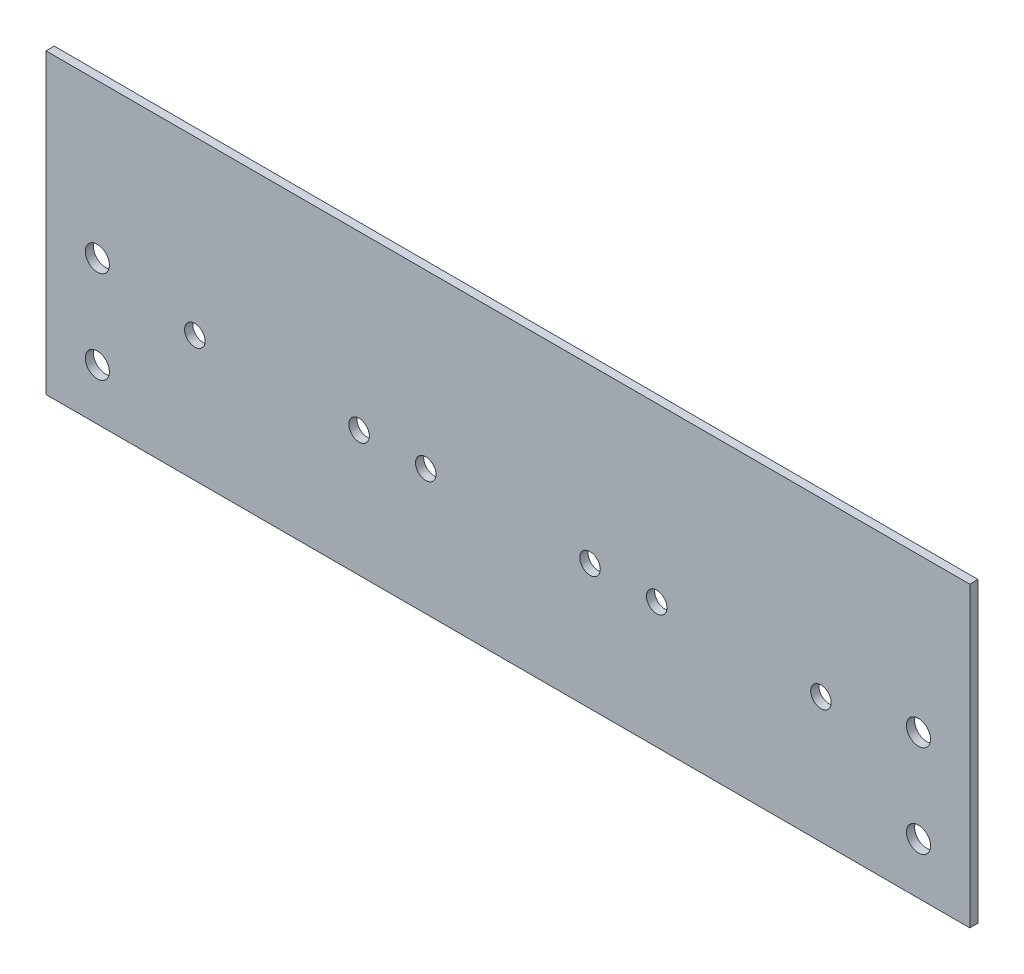
ISO-10303-21;
HEADER;
FILE_DESCRIPTION(('STEP AP214'),'2;1');
FILE_NAME('part.step','',(''),(''),'','','');
FILE_SCHEMA(('AUTOMOTIVE_DESIGN { 1 0 10303 214 1 1 1 1 }'));
ENDSEC;
DATA;
#1=APPLICATION_CONTEXT('core data for automotive mechanical design processes');
#2=APPLICATION_PROTOCOL_DEFINITION('international standard','automotive_design',2000,#1);
#3=PRODUCT_CONTEXT('',#1,'mechanical');
#4=PRODUCT('Part','Part','',(#3));
#5=PRODUCT_RELATED_PRODUCT_CATEGORY('part','',(#4));
#6=PRODUCT_DEFINITION_FORMATION('','',#4);
#7=PRODUCT_DEFINITION_CONTEXT('part definition',#1,'design');
#8=PRODUCT_DEFINITION('design','',#6,#7);
#9=PRODUCT_DEFINITION_SHAPE('','',#8);
#10=(LENGTH_UNIT() NAMED_UNIT(*) SI_UNIT(.MILLI.,.METRE.));
#11=(NAMED_UNIT(*) PLANE_ANGLE_UNIT() SI_UNIT($,.RADIAN.));
#12=(NAMED_UNIT(*) SI_UNIT($,.STERADIAN.) SOLID_ANGLE_UNIT());
#13=UNCERTAINTY_MEASURE_WITH_UNIT(LENGTH_MEASURE(1.E-05),#10,'distance_accuracy_value','');
#14=(GEOMETRIC_REPRESENTATION_CONTEXT(3) GLOBAL_UNCERTAINTY_ASSIGNED_CONTEXT((#13)) GLOBAL_UNIT_ASSIGNED_CONTEXT((#10,
#11,#12)) REPRESENTATION_CONTEXT('',''));
#15=CARTESIAN_POINT('',(0.,0.,0.));
#16=DIRECTION('',(0.,0.,1.));
#17=DIRECTION('',(1.,0.,0.));
#18=AXIS2_PLACEMENT_3D('',#15,#16,#17);
#19=CARTESIAN_POINT('',(180.,0.,1.6));
#20=DIRECTION('',(1.,0.,0.));
#21=DIRECTION('',(0.,0.,-1.));
#22=AXIS2_PLACEMENT_3D('',#19,#20,#21);
#23=PLANE('',#22);
#24=DIRECTION('',(0.,-1.,0.));
#25=VECTOR('',#24,1.);
#26=CARTESIAN_POINT('',(180.,0.,0.));
#27=LINE('',#26,#25);
#28=CARTESIAN_POINT('',(180.,58.,0.));
#29=VERTEX_POINT('',#28);
#30=CARTESIAN_POINT('',(180.,0.,0.));
#31=VERTEX_POINT('',#30);
#32=EDGE_CURVE('E137',#29,#31,#27,.T.);
#33=ORIENTED_EDGE('',*,*,#32,.F.);
#34=DIRECTION('',(0.,0.,-1.));
#35=VECTOR('',#34,1.);
#36=CARTESIAN_POINT('',(180.,58.,1.6));
#37=LINE('',#36,#35);
#38=CARTESIAN_POINT('',(180.,58.,1.6));
#39=VERTEX_POINT('',#38);
#40=EDGE_CURVE('E11',#39,#29,#37,.T.);
#41=ORIENTED_EDGE('',*,*,#40,.F.);
#42=DIRECTION('',(0.,-1.,0.));
#43=VECTOR('',#42,1.);
#44=CARTESIAN_POINT('',(180.,0.,1.6));
#45=LINE('',#44,#43);
#46=CARTESIAN_POINT('',(180.,0.,1.6));
#47=VERTEX_POINT('',#46);
#48=EDGE_CURVE('E100',#39,#47,#45,.T.);
#49=ORIENTED_EDGE('',*,*,#48,.T.);
#50=DIRECTION('',(0.,0.,-1.));
#51=VECTOR('',#50,1.);
#52=CARTESIAN_POINT('',(180.,0.,1.6));
#53=LINE('',#52,#51);
#54=EDGE_CURVE('E79',#47,#31,#53,.T.);
#55=ORIENTED_EDGE('',*,*,#54,.T.);
#56=EDGE_LOOP('',(#33,#41,#49,#55));
#57=FACE_BOUND('',#56,.T.);
#58=ADVANCED_FACE('F39',(#57),#23,.T.);
#59=CARTESIAN_POINT('',(0.,58.,1.6));
#60=DIRECTION('',(0.,1.,0.));
#61=DIRECTION('',(0.,0.,1.));
#62=AXIS2_PLACEMENT_3D('',#59,#60,#61);
#63=PLANE('',#62);
#64=DIRECTION('',(1.,0.,0.));
#65=VECTOR('',#64,1.);
#66=CARTESIAN_POINT('',(0.,58.,0.));
#67=LINE('',#66,#65);
#68=CARTESIAN_POINT('',(0.,58.,0.));
#69=VERTEX_POINT('',#68);
#70=EDGE_CURVE('E91',#69,#29,#67,.T.);
#71=ORIENTED_EDGE('',*,*,#70,.F.);
#72=DIRECTION('',(0.,0.,-1.));
#73=VECTOR('',#72,1.);
#74=CARTESIAN_POINT('',(0.,58.,1.6));
#75=LINE('',#74,#73);
#76=CARTESIAN_POINT('',(0.,58.,1.6));
#77=VERTEX_POINT('',#76);
#78=EDGE_CURVE('E48',#77,#69,#75,.T.);
#79=ORIENTED_EDGE('',*,*,#78,.F.);
#80=DIRECTION('',(1.,0.,0.));
#81=VECTOR('',#80,1.);
#82=CARTESIAN_POINT('',(0.,58.,1.6));
#83=LINE('',#82,#81);
#84=EDGE_CURVE('E89',#77,#39,#83,.T.);
#85=ORIENTED_EDGE('',*,*,#84,.T.);
#86=ORIENTED_EDGE('',*,*,#40,.T.);
#87=EDGE_LOOP('',(#71,#79,#85,#86));
#88=FACE_BOUND('',#87,.T.);
#89=ADVANCED_FACE('F87',(#88),#63,.T.);
#90=CARTESIAN_POINT('',(0.,0.,1.6));
#91=DIRECTION('',(1.,0.,0.));
#92=DIRECTION('',(0.,1.,0.));
#93=AXIS2_PLACEMENT_3D('',#90,#91,#92);
#94=PLANE('',#93);
#95=DIRECTION('',(0.,-1.,0.));
#96=VECTOR('',#95,1.);
#97=CARTESIAN_POINT('',(0.,0.,0.));
#98=LINE('',#97,#96);
#99=CARTESIAN_POINT('',(0.,0.,0.));
#100=VERTEX_POINT('',#99);
#101=EDGE_CURVE('E140',#69,#100,#98,.T.);
#102=ORIENTED_EDGE('',*,*,#101,.T.);
#103=DIRECTION('',(0.,0.,-1.));
#104=VECTOR('',#103,1.);
#105=CARTESIAN_POINT('',(0.,0.,1.6));
#106=LINE('',#105,#104);
#107=CARTESIAN_POINT('',(0.,0.,1.6));
#108=VERTEX_POINT('',#107);
#109=EDGE_CURVE('E94',#108,#100,#106,.T.);
#110=ORIENTED_EDGE('',*,*,#109,.F.);
#111=DIRECTION('',(0.,-1.,0.));
#112=VECTOR('',#111,1.);
#113=CARTESIAN_POINT('',(0.,0.,1.6));
#114=LINE('',#113,#112);
#115=EDGE_CURVE('E96',#77,#108,#114,.T.);
#116=ORIENTED_EDGE('',*,*,#115,.F.);
#117=ORIENTED_EDGE('',*,*,#78,.T.);
#118=EDGE_LOOP('',(#102,#110,#116,#117));
#119=FACE_BOUND('',#118,.T.);
#120=ADVANCED_FACE('F97',(#119),#94,.F.);
#121=CARTESIAN_POINT('',(10.,28.,1.6));
#122=DIRECTION('',(0.,0.,-1.));
#123=DIRECTION('',(-1.,0.,0.));
#124=AXIS2_PLACEMENT_3D('',#121,#122,#123);
#125=CYLINDRICAL_SURFACE('',#124,2.35000000000001);
#126=CARTESIAN_POINT('',(10.,28.,1.6));
#127=DIRECTION('',(0.,0.,1.));
#128=DIRECTION('',(1.,0.,0.));
#129=AXIS2_PLACEMENT_3D('',#126,#127,#128);
#130=CIRCLE('',#129,2.35000000000001);
#131=CARTESIAN_POINT('',(12.35,28.,1.6));
#132=VERTEX_POINT('',#131);
#133=EDGE_CURVE('E102',#132,#132,#130,.T.);
#134=ORIENTED_EDGE('',*,*,#133,.T.);
#135=EDGE_LOOP('',(#134));
#136=FACE_BOUND('',#135,.T.);
#137=CARTESIAN_POINT('',(10.,28.,0.));
#138=DIRECTION('',(0.,0.,1.));
#139=DIRECTION('',(1.,0.,0.));
#140=AXIS2_PLACEMENT_3D('',#137,#138,#139);
#141=CIRCLE('',#140,2.35000000000001);
#142=CARTESIAN_POINT('',(12.35,28.,0.));
#143=VERTEX_POINT('',#142);
#144=EDGE_CURVE('E134',#143,#143,#141,.T.);
#145=ORIENTED_EDGE('',*,*,#144,.F.);
#146=EDGE_LOOP('',(#145));
#147=FACE_BOUND('',#146,.T.);
#148=ADVANCED_FACE('F156',(#136,#147),#125,.F.);
#149=CARTESIAN_POINT('',(10.,10.0000000000005,1.6));
#150=DIRECTION('',(0.,0.,-1.));
#151=DIRECTION('',(-1.,0.,0.));
#152=AXIS2_PLACEMENT_3D('',#149,#150,#151);
#153=CYLINDRICAL_SURFACE('',#152,2.35);
#154=CARTESIAN_POINT('',(10.,10.0000000000005,1.6));
#155=DIRECTION('',(0.,0.,1.));
#156=DIRECTION('',(1.,0.,0.));
#157=AXIS2_PLACEMENT_3D('',#154,#155,#156);
#158=CIRCLE('',#157,2.35);
#159=CARTESIAN_POINT('',(12.35,10.0000000000005,1.6));
#160=VERTEX_POINT('',#159);
#161=EDGE_CURVE('E390',#160,#160,#158,.T.);
#162=ORIENTED_EDGE('',*,*,#161,.T.);
#163=EDGE_LOOP('',(#162));
#164=FACE_BOUND('',#163,.T.);
#165=CARTESIAN_POINT('',(10.,10.0000000000005,0.));
#166=DIRECTION('',(0.,0.,1.));
#167=DIRECTION('',(1.,0.,0.));
#168=AXIS2_PLACEMENT_3D('',#165,#166,#167);
#169=CIRCLE('',#168,2.35);
#170=CARTESIAN_POINT('',(12.35,10.0000000000005,0.));
#171=VERTEX_POINT('',#170);
#172=EDGE_CURVE('E131',#171,#171,#169,.T.);
#173=ORIENTED_EDGE('',*,*,#172,.F.);
#174=EDGE_LOOP('',(#173));
#175=FACE_BOUND('',#174,.T.);
#176=ADVANCED_FACE('F159',(#164,#175),#153,.F.);
#177=CARTESIAN_POINT('',(29.,24.5000000000005,1.6));
#178=DIRECTION('',(0.,0.,-1.));
#179=DIRECTION('',(-1.,0.,0.));
#180=AXIS2_PLACEMENT_3D('',#177,#178,#179);
#181=CYLINDRICAL_SURFACE('',#180,1.99999999999995);
#182=CARTESIAN_POINT('',(29.,24.5000000000005,1.6));
#183=DIRECTION('',(0.,0.,1.));
#184=DIRECTION('',(1.,0.,0.));
#185=AXIS2_PLACEMENT_3D('',#182,#183,#184);
#186=CIRCLE('',#185,1.99999999999995);
#187=CARTESIAN_POINT('',(31.,24.5000000000005,1.6));
#188=VERTEX_POINT('',#187);
#189=EDGE_CURVE('E386',#188,#188,#186,.T.);
#190=ORIENTED_EDGE('',*,*,#189,.T.);
#191=EDGE_LOOP('',(#190));
#192=FACE_BOUND('',#191,.T.);
#193=CARTESIAN_POINT('',(29.,24.5000000000005,0.));
#194=DIRECTION('',(0.,0.,1.));
#195=DIRECTION('',(1.,0.,0.));
#196=AXIS2_PLACEMENT_3D('',#193,#194,#195);
#197=CIRCLE('',#196,1.99999999999995);
#198=CARTESIAN_POINT('',(31.,24.5000000000005,0.));
#199=VERTEX_POINT('',#198);
#200=EDGE_CURVE('E128',#199,#199,#197,.T.);
#201=ORIENTED_EDGE('',*,*,#200,.F.);
#202=EDGE_LOOP('',(#201));
#203=FACE_BOUND('',#202,.T.);
#204=ADVANCED_FACE('F163',(#192,#203),#181,.F.);
#205=CARTESIAN_POINT('',(61.,24.5000000000005,1.6));
#206=DIRECTION('',(0.,0.,-1.));
#207=DIRECTION('',(-1.,0.,0.));
#208=AXIS2_PLACEMENT_3D('',#205,#206,#207);
#209=CYLINDRICAL_SURFACE('',#208,1.99999999999997);
#210=CARTESIAN_POINT('',(61.,24.5000000000005,1.6));
#211=DIRECTION('',(0.,0.,1.));
#212=DIRECTION('',(1.,0.,0.));
#213=AXIS2_PLACEMENT_3D('',#210,#211,#212);
#214=CIRCLE('',#213,1.99999999999997);
#215=CARTESIAN_POINT('',(63.,24.5000000000005,1.6));
#216=VERTEX_POINT('',#215);
#217=EDGE_CURVE('E382',#216,#216,#214,.T.);
#218=ORIENTED_EDGE('',*,*,#217,.T.);
#219=EDGE_LOOP('',(#218));
#220=FACE_BOUND('',#219,.T.);
#221=CARTESIAN_POINT('',(61.,24.5000000000005,0.));
#222=DIRECTION('',(0.,0.,1.));
#223=DIRECTION('',(1.,0.,0.));
#224=AXIS2_PLACEMENT_3D('',#221,#222,#223);
#225=CIRCLE('',#224,1.99999999999997);
#226=CARTESIAN_POINT('',(63.,24.5000000000005,0.));
#227=VERTEX_POINT('',#226);
#228=EDGE_CURVE('E125',#227,#227,#225,.T.);
#229=ORIENTED_EDGE('',*,*,#228,.F.);
#230=EDGE_LOOP('',(#229));
#231=FACE_BOUND('',#230,.T.);
#232=ADVANCED_FACE('F167',(#220,#231),#209,.F.);
#233=CARTESIAN_POINT('',(74.,24.5000000000005,1.6));
#234=DIRECTION('',(0.,0.,-1.));
#235=DIRECTION('',(-1.,0.,0.));
#236=AXIS2_PLACEMENT_3D('',#233,#234,#235);
#237=CYLINDRICAL_SURFACE('',#236,1.99999999999982);
#238=CARTESIAN_POINT('',(74.,24.5000000000005,1.6));
#239=DIRECTION('',(0.,0.,1.));
#240=DIRECTION('',(1.,0.,0.));
#241=AXIS2_PLACEMENT_3D('',#238,#239,#240);
#242=CIRCLE('',#241,1.99999999999982);
#243=CARTESIAN_POINT('',(75.9999999999998,24.5000000000005,1.6));
#244=VERTEX_POINT('',#243);
#245=EDGE_CURVE('E378',#244,#244,#242,.T.);
#246=ORIENTED_EDGE('',*,*,#245,.T.);
#247=EDGE_LOOP('',(#246));
#248=FACE_BOUND('',#247,.T.);
#249=CARTESIAN_POINT('',(74.,24.5000000000005,0.));
#250=DIRECTION('',(0.,0.,1.));
#251=DIRECTION('',(1.,0.,0.));
#252=AXIS2_PLACEMENT_3D('',#249,#250,#251);
#253=CIRCLE('',#252,1.99999999999982);
#254=CARTESIAN_POINT('',(75.9999999999998,24.5000000000005,0.));
#255=VERTEX_POINT('',#254);
#256=EDGE_CURVE('E122',#255,#255,#253,.T.);
#257=ORIENTED_EDGE('',*,*,#256,.F.);
#258=EDGE_LOOP('',(#257));
#259=FACE_BOUND('',#258,.T.);
#260=ADVANCED_FACE('F171',(#248,#259),#237,.F.);
#261=CARTESIAN_POINT('',(106.,24.5000000000005,1.6));
#262=DIRECTION('',(0.,0.,-1.));
#263=DIRECTION('',(-1.,0.,0.));
#264=AXIS2_PLACEMENT_3D('',#261,#262,#263);
#265=CYLINDRICAL_SURFACE('',#264,1.99999999999984);
#266=CARTESIAN_POINT('',(106.,24.5000000000005,1.6));
#267=DIRECTION('',(0.,0.,1.));
#268=DIRECTION('',(1.,0.,0.));
#269=AXIS2_PLACEMENT_3D('',#266,#267,#268);
#270=CIRCLE('',#269,1.99999999999984);
#271=CARTESIAN_POINT('',(108.,24.5000000000005,1.6));
#272=VERTEX_POINT('',#271);
#273=EDGE_CURVE('E374',#272,#272,#270,.T.);
#274=ORIENTED_EDGE('',*,*,#273,.T.);
#275=EDGE_LOOP('',(#274));
#276=FACE_BOUND('',#275,.T.);
#277=CARTESIAN_POINT('',(106.,24.5000000000005,0.));
#278=DIRECTION('',(0.,0.,1.));
#279=DIRECTION('',(1.,0.,0.));
#280=AXIS2_PLACEMENT_3D('',#277,#278,#279);
#281=CIRCLE('',#280,1.99999999999984);
#282=CARTESIAN_POINT('',(108.,24.5000000000005,0.));
#283=VERTEX_POINT('',#282);
#284=EDGE_CURVE('E119',#283,#283,#281,.T.);
#285=ORIENTED_EDGE('',*,*,#284,.F.);
#286=EDGE_LOOP('',(#285));
#287=FACE_BOUND('',#286,.T.);
#288=ADVANCED_FACE('F175',(#276,#287),#265,.F.);
#289=CARTESIAN_POINT('',(119.,24.5000000000005,1.6));
#290=DIRECTION('',(0.,0.,-1.));
#291=DIRECTION('',(-1.,0.,0.));
#292=AXIS2_PLACEMENT_3D('',#289,#290,#291);
#293=CYLINDRICAL_SURFACE('',#292,1.99999999999994);
#294=CARTESIAN_POINT('',(119.,24.5000000000005,1.6));
#295=DIRECTION('',(0.,0.,1.));
#296=DIRECTION('',(1.,0.,0.));
#297=AXIS2_PLACEMENT_3D('',#294,#295,#296);
#298=CIRCLE('',#297,1.99999999999994);
#299=CARTESIAN_POINT('',(121.,24.5000000000005,1.6));
#300=VERTEX_POINT('',#299);
#301=EDGE_CURVE('E370',#300,#300,#298,.T.);
#302=ORIENTED_EDGE('',*,*,#301,.T.);
#303=EDGE_LOOP('',(#302));
#304=FACE_BOUND('',#303,.T.);
#305=CARTESIAN_POINT('',(119.,24.5000000000005,0.));
#306=DIRECTION('',(0.,0.,1.));
#307=DIRECTION('',(1.,0.,0.));
#308=AXIS2_PLACEMENT_3D('',#305,#306,#307);
#309=CIRCLE('',#308,1.99999999999994);
#310=CARTESIAN_POINT('',(121.,24.5000000000005,0.));
#311=VERTEX_POINT('',#310);
#312=EDGE_CURVE('E116',#311,#311,#309,.T.);
#313=ORIENTED_EDGE('',*,*,#312,.F.);
#314=EDGE_LOOP('',(#313));
#315=FACE_BOUND('',#314,.T.);
#316=ADVANCED_FACE('F179',(#304,#315),#293,.F.);
#317=CARTESIAN_POINT('',(151.,24.5000000000005,1.6));
#318=DIRECTION('',(0.,0.,-1.));
#319=DIRECTION('',(-1.,0.,0.));
#320=AXIS2_PLACEMENT_3D('',#317,#318,#319);
#321=CYLINDRICAL_SURFACE('',#320,1.99999999999994);
#322=CARTESIAN_POINT('',(151.,24.5000000000005,1.6));
#323=DIRECTION('',(0.,0.,1.));
#324=DIRECTION('',(1.,0.,0.));
#325=AXIS2_PLACEMENT_3D('',#322,#323,#324);
#326=CIRCLE('',#325,1.99999999999994);
#327=CARTESIAN_POINT('',(153.,24.5000000000005,1.6));
#328=VERTEX_POINT('',#327);
#329=EDGE_CURVE('E366',#328,#328,#326,.T.);
#330=ORIENTED_EDGE('',*,*,#329,.T.);
#331=EDGE_LOOP('',(#330));
#332=FACE_BOUND('',#331,.T.);
#333=CARTESIAN_POINT('',(151.,24.5000000000005,0.));
#334=DIRECTION('',(0.,0.,1.));
#335=DIRECTION('',(1.,0.,0.));
#336=AXIS2_PLACEMENT_3D('',#333,#334,#335);
#337=CIRCLE('',#336,1.99999999999994);
#338=CARTESIAN_POINT('',(153.,24.5000000000005,0.));
#339=VERTEX_POINT('',#338);
#340=EDGE_CURVE('E113',#339,#339,#337,.T.);
#341=ORIENTED_EDGE('',*,*,#340,.F.);
#342=EDGE_LOOP('',(#341));
#343=FACE_BOUND('',#342,.T.);
#344=ADVANCED_FACE('F183',(#332,#343),#321,.F.);
#345=CARTESIAN_POINT('',(170.,28.,1.6));
#346=DIRECTION('',(0.,0.,-1.));
#347=DIRECTION('',(-1.,0.,0.));
#348=AXIS2_PLACEMENT_3D('',#345,#346,#347);
#349=CYLINDRICAL_SURFACE('',#348,2.35);
#350=CARTESIAN_POINT('',(170.,28.,1.6));
#351=DIRECTION('',(0.,0.,1.));
#352=DIRECTION('',(1.,0.,0.));
#353=AXIS2_PLACEMENT_3D('',#350,#351,#352);
#354=CIRCLE('',#353,2.35);
#355=CARTESIAN_POINT('',(172.35,28.,1.6));
#356=VERTEX_POINT('',#355);
#357=EDGE_CURVE('E197',#356,#356,#354,.T.);
#358=ORIENTED_EDGE('',*,*,#357,.T.);
#359=EDGE_LOOP('',(#358));
#360=FACE_BOUND('',#359,.T.);
#361=CARTESIAN_POINT('',(170.,28.,0.));
#362=DIRECTION('',(0.,0.,1.));
#363=DIRECTION('',(1.,0.,0.));
#364=AXIS2_PLACEMENT_3D('',#361,#362,#363);
#365=CIRCLE('',#364,2.35);
#366=CARTESIAN_POINT('',(172.35,28.,0.));
#367=VERTEX_POINT('',#366);
#368=EDGE_CURVE('E110',#367,#367,#365,.T.);
#369=ORIENTED_EDGE('',*,*,#368,.F.);
#370=EDGE_LOOP('',(#369));
#371=FACE_BOUND('',#370,.T.);
#372=ADVANCED_FACE('F186',(#360,#371),#349,.F.);
#373=CARTESIAN_POINT('',(170.,10.0000000000005,1.6));
#374=DIRECTION('',(0.,0.,-1.));
#375=DIRECTION('',(-1.,0.,0.));
#376=AXIS2_PLACEMENT_3D('',#373,#374,#375);
#377=CYLINDRICAL_SURFACE('',#376,2.35);
#378=CARTESIAN_POINT('',(170.,10.0000000000005,1.6));
#379=DIRECTION('',(0.,0.,1.));
#380=DIRECTION('',(1.,0.,0.));
#381=AXIS2_PLACEMENT_3D('',#378,#379,#380);
#382=CIRCLE('',#381,2.35);
#383=CARTESIAN_POINT('',(172.35,10.0000000000005,1.6));
#384=VERTEX_POINT('',#383);
#385=EDGE_CURVE('E143',#384,#384,#382,.T.);
#386=ORIENTED_EDGE('',*,*,#385,.T.);
#387=EDGE_LOOP('',(#386));
#388=FACE_BOUND('',#387,.T.);
#389=CARTESIAN_POINT('',(170.,10.0000000000005,0.));
#390=DIRECTION('',(0.,0.,1.));
#391=DIRECTION('',(1.,0.,0.));
#392=AXIS2_PLACEMENT_3D('',#389,#390,#391);
#393=CIRCLE('',#392,2.35);
#394=CARTESIAN_POINT('',(172.35,10.0000000000005,0.));
#395=VERTEX_POINT('',#394);
#396=EDGE_CURVE('E107',#395,#395,#393,.T.);
#397=ORIENTED_EDGE('',*,*,#396,.F.);
#398=EDGE_LOOP('',(#397));
#399=FACE_BOUND('',#398,.T.);
#400=ADVANCED_FACE('F41',(#388,#399),#377,.F.);
#401=CARTESIAN_POINT('',(0.,0.,1.6));
#402=DIRECTION('',(0.,1.,0.));
#403=DIRECTION('',(0.,0.,1.));
#404=AXIS2_PLACEMENT_3D('',#401,#402,#403);
#405=PLANE('',#404);
#406=DIRECTION('',(1.,0.,0.));
#407=VECTOR('',#406,1.);
#408=CARTESIAN_POINT('',(0.,0.,0.));
#409=LINE('',#408,#407);
#410=EDGE_CURVE('E72',#100,#31,#409,.T.);
#411=ORIENTED_EDGE('',*,*,#410,.T.);
#412=ORIENTED_EDGE('',*,*,#54,.F.);
#413=DIRECTION('',(1.,0.,0.));
#414=VECTOR('',#413,1.);
#415=CARTESIAN_POINT('',(0.,0.,1.6));
#416=LINE('',#415,#414);
#417=EDGE_CURVE('E56',#108,#47,#416,.T.);
#418=ORIENTED_EDGE('',*,*,#417,.F.);
#419=ORIENTED_EDGE('',*,*,#109,.T.);
#420=EDGE_LOOP('',(#411,#412,#418,#419));
#421=FACE_BOUND('',#420,.T.);
#422=ADVANCED_FACE('F146',(#421),#405,.F.);
#423=CARTESIAN_POINT('',(0.,0.,1.6));
#424=DIRECTION('',(0.,0.,1.));
#425=DIRECTION('',(1.,0.,0.));
#426=AXIS2_PLACEMENT_3D('',#423,#424,#425);
#427=PLANE('',#426);
#428=ORIENTED_EDGE('',*,*,#385,.F.);
#429=EDGE_LOOP('',(#428));
#430=FACE_BOUND('',#429,.T.);
#431=ORIENTED_EDGE('',*,*,#357,.F.);
#432=EDGE_LOOP('',(#431));
#433=FACE_BOUND('',#432,.T.);
#434=ORIENTED_EDGE('',*,*,#329,.F.);
#435=EDGE_LOOP('',(#434));
#436=FACE_BOUND('',#435,.T.);
#437=ORIENTED_EDGE('',*,*,#301,.F.);
#438=EDGE_LOOP('',(#437));
#439=FACE_BOUND('',#438,.T.);
#440=ORIENTED_EDGE('',*,*,#273,.F.);
#441=EDGE_LOOP('',(#440));
#442=FACE_BOUND('',#441,.T.);
#443=ORIENTED_EDGE('',*,*,#245,.F.);
#444=EDGE_LOOP('',(#443));
#445=FACE_BOUND('',#444,.T.);
#446=ORIENTED_EDGE('',*,*,#217,.F.);
#447=EDGE_LOOP('',(#446));
#448=FACE_BOUND('',#447,.T.);
#449=ORIENTED_EDGE('',*,*,#189,.F.);
#450=EDGE_LOOP('',(#449));
#451=FACE_BOUND('',#450,.T.);
#452=ORIENTED_EDGE('',*,*,#161,.F.);
#453=EDGE_LOOP('',(#452));
#454=FACE_BOUND('',#453,.T.);
#455=ORIENTED_EDGE('',*,*,#133,.F.);
#456=EDGE_LOOP('',(#455));
#457=FACE_BOUND('',#456,.T.);
#458=ORIENTED_EDGE('',*,*,#48,.F.);
#459=ORIENTED_EDGE('',*,*,#84,.F.);
#460=ORIENTED_EDGE('',*,*,#115,.T.);
#461=ORIENTED_EDGE('',*,*,#417,.T.);
#462=EDGE_LOOP('',(#458,#459,#460,#461));
#463=FACE_BOUND('',#462,.T.);
#464=ADVANCED_FACE('F99',(#430,#433,#436,#439,#442,#445,#448,#451,#454,#457,#463),#427,.T.);
#465=CARTESIAN_POINT('',(0.,0.,0.));
#466=DIRECTION('',(0.,0.,1.));
#467=DIRECTION('',(1.,0.,0.));
#468=AXIS2_PLACEMENT_3D('',#465,#466,#467);
#469=PLANE('',#468);
#470=ORIENTED_EDGE('',*,*,#396,.T.);
#471=EDGE_LOOP('',(#470));
#472=FACE_BOUND('',#471,.T.);
#473=ORIENTED_EDGE('',*,*,#368,.T.);
#474=EDGE_LOOP('',(#473));
#475=FACE_BOUND('',#474,.T.);
#476=ORIENTED_EDGE('',*,*,#340,.T.);
#477=EDGE_LOOP('',(#476));
#478=FACE_BOUND('',#477,.T.);
#479=ORIENTED_EDGE('',*,*,#312,.T.);
#480=EDGE_LOOP('',(#479));
#481=FACE_BOUND('',#480,.T.);
#482=ORIENTED_EDGE('',*,*,#284,.T.);
#483=EDGE_LOOP('',(#482));
#484=FACE_BOUND('',#483,.T.);
#485=ORIENTED_EDGE('',*,*,#256,.T.);
#486=EDGE_LOOP('',(#485));
#487=FACE_BOUND('',#486,.T.);
#488=ORIENTED_EDGE('',*,*,#228,.T.);
#489=EDGE_LOOP('',(#488));
#490=FACE_BOUND('',#489,.T.);
#491=ORIENTED_EDGE('',*,*,#200,.T.);
#492=EDGE_LOOP('',(#491));
#493=FACE_BOUND('',#492,.T.);
#494=ORIENTED_EDGE('',*,*,#172,.T.);
#495=EDGE_LOOP('',(#494));
#496=FACE_BOUND('',#495,.T.);
#497=ORIENTED_EDGE('',*,*,#144,.T.);
#498=EDGE_LOOP('',(#497));
#499=FACE_BOUND('',#498,.T.);
#500=ORIENTED_EDGE('',*,*,#32,.T.);
#501=ORIENTED_EDGE('',*,*,#410,.F.);
#502=ORIENTED_EDGE('',*,*,#101,.F.);
#503=ORIENTED_EDGE('',*,*,#70,.T.);
#504=EDGE_LOOP('',(#500,#501,#502,#503));
#505=FACE_BOUND('',#504,.T.);
#506=ADVANCED_FACE('F147',(#472,#475,#478,#481,#484,#487,#490,#493,#496,#499,#505),#469,.F.);
#507=CLOSED_SHELL('',(#58,#89,#120,#148,#176,#204,#232,#260,#288,#316,#344,#372,#400,#422,#464,#506));
#508=MANIFOLD_SOLID_BREP('B2',#507);
#509=ADVANCED_BREP_SHAPE_REPRESENTATION('',(#18,#508),#14);
#510=SHAPE_DEFINITION_REPRESENTATION(#9,#509);
ENDSEC;
END-ISO-10303-21;
